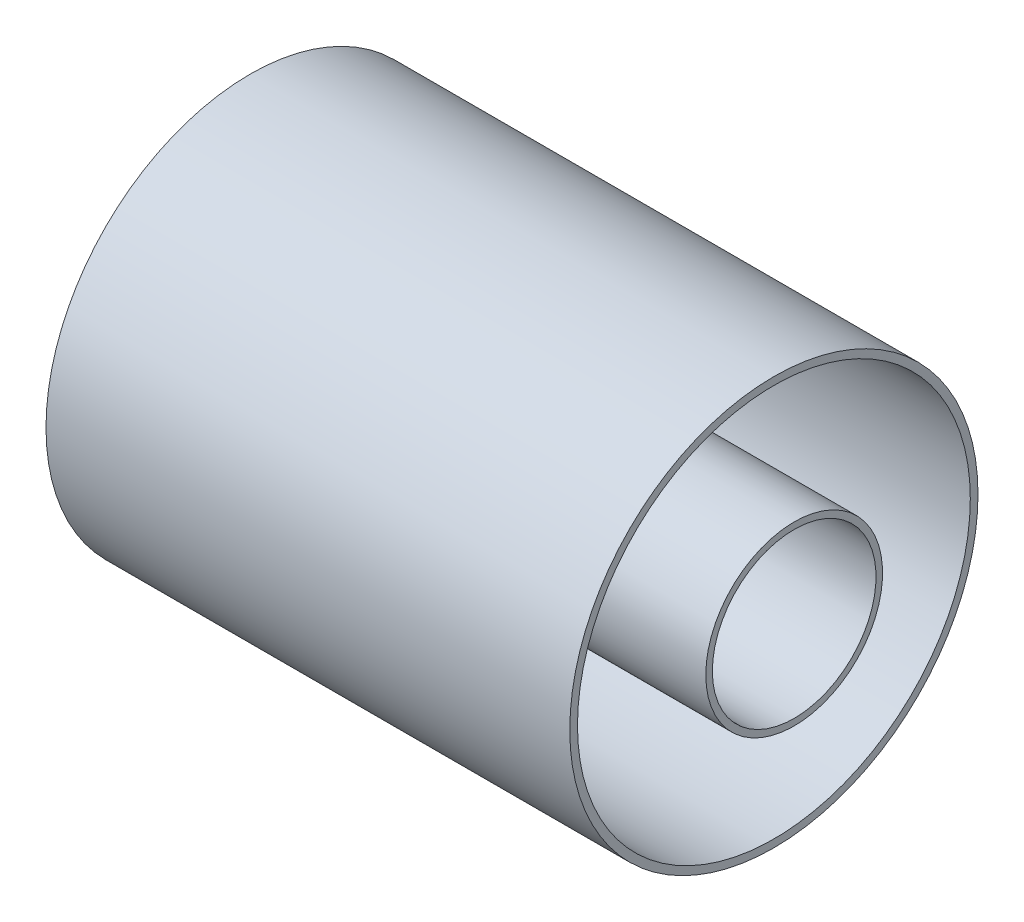
ISO-10303-21;
HEADER;
FILE_DESCRIPTION(('STEP AP214'),'2;1');
FILE_NAME('part.step','',(''),(''),'','','');
FILE_SCHEMA(('AUTOMOTIVE_DESIGN { 1 0 10303 214 1 1 1 1 }'));
ENDSEC;
DATA;
#1=APPLICATION_CONTEXT('core data for automotive mechanical design processes');
#2=APPLICATION_PROTOCOL_DEFINITION('international standard','automotive_design',2000,#1);
#3=PRODUCT_CONTEXT('',#1,'mechanical');
#4=PRODUCT('Part','Part','',(#3));
#5=PRODUCT_RELATED_PRODUCT_CATEGORY('part','',(#4));
#6=PRODUCT_DEFINITION_FORMATION('','',#4);
#7=PRODUCT_DEFINITION_CONTEXT('part definition',#1,'design');
#8=PRODUCT_DEFINITION('design','',#6,#7);
#9=PRODUCT_DEFINITION_SHAPE('','',#8);
#10=(LENGTH_UNIT() NAMED_UNIT(*) SI_UNIT(.MILLI.,.METRE.));
#11=(NAMED_UNIT(*) PLANE_ANGLE_UNIT() SI_UNIT($,.RADIAN.));
#12=(NAMED_UNIT(*) SI_UNIT($,.STERADIAN.) SOLID_ANGLE_UNIT());
#13=UNCERTAINTY_MEASURE_WITH_UNIT(LENGTH_MEASURE(1.E-05),#10,'distance_accuracy_value','');
#14=(GEOMETRIC_REPRESENTATION_CONTEXT(3) GLOBAL_UNCERTAINTY_ASSIGNED_CONTEXT((#13)) GLOBAL_UNIT_ASSIGNED_CONTEXT((#10,
#11,#12)) REPRESENTATION_CONTEXT('',''));
#15=CARTESIAN_POINT('',(0.,0.,0.));
#16=DIRECTION('',(0.,0.,1.));
#17=DIRECTION('',(1.,0.,0.));
#18=AXIS2_PLACEMENT_3D('',#15,#16,#17);
#19=CARTESIAN_POINT('',(-150.920009985663,79.1845,0.));
#20=DIRECTION('',(1.,0.,0.));
#21=DIRECTION('',(0.,0.,-1.));
#22=AXIS2_PLACEMENT_3D('',#19,#20,#21);
#23=PLANE('',#22);
#24=CARTESIAN_POINT('',(-150.920009985663,0.,0.));
#25=DIRECTION('',(-1.,0.,0.));
#26=DIRECTION('',(0.,0.,1.));
#27=AXIS2_PLACEMENT_3D('',#24,#25,#26);
#28=CIRCLE('',#27,76.2);
#29=CARTESIAN_POINT('',(-150.920009985663,0.,76.2));
#30=VERTEX_POINT('',#29);
#31=EDGE_CURVE('E58',#30,#30,#28,.T.);
#32=ORIENTED_EDGE('',*,*,#31,.F.);
#33=EDGE_LOOP('',(#32));
#34=FACE_BOUND('',#33,.T.);
#35=CARTESIAN_POINT('',(-150.920009985663,0.,0.));
#36=DIRECTION('',(-1.,0.,0.));
#37=DIRECTION('',(0.,0.,1.));
#38=AXIS2_PLACEMENT_3D('',#35,#36,#37);
#39=CIRCLE('',#38,79.1845);
#40=CARTESIAN_POINT('',(-150.920009985663,0.,79.1845));
#41=VERTEX_POINT('',#40);
#42=EDGE_CURVE('E11',#41,#41,#39,.T.);
#43=ORIENTED_EDGE('',*,*,#42,.T.);
#44=EDGE_LOOP('',(#43));
#45=FACE_BOUND('',#44,.T.);
#46=ADVANCED_FACE('F43',(#34,#45),#23,.F.);
#47=CARTESIAN_POINT('',(0.,0.,0.));
#48=DIRECTION('',(-1.,0.,0.));
#49=DIRECTION('',(0.,0.,1.));
#50=AXIS2_PLACEMENT_3D('',#47,#48,#49);
#51=CYLINDRICAL_SURFACE('',#50,76.2);
#52=CARTESIAN_POINT('',(52.2799900143375,0.,0.));
#53=DIRECTION('',(-1.,0.,0.));
#54=DIRECTION('',(0.,0.,1.));
#55=AXIS2_PLACEMENT_3D('',#52,#53,#54);
#56=CIRCLE('',#55,76.2);
#57=CARTESIAN_POINT('',(52.2799900143375,0.,76.2));
#58=VERTEX_POINT('',#57);
#59=EDGE_CURVE('E54',#58,#58,#56,.T.);
#60=ORIENTED_EDGE('',*,*,#59,.F.);
#61=EDGE_LOOP('',(#60));
#62=FACE_BOUND('',#61,.T.);
#63=ORIENTED_EDGE('',*,*,#31,.T.);
#64=EDGE_LOOP('',(#63));
#65=FACE_BOUND('',#64,.T.);
#66=ADVANCED_FACE('F64',(#62,#65),#51,.F.);
#67=CARTESIAN_POINT('',(52.2799900143375,79.1845,0.));
#68=DIRECTION('',(1.,0.,0.));
#69=DIRECTION('',(0.,0.,-1.));
#70=AXIS2_PLACEMENT_3D('',#67,#68,#69);
#71=PLANE('',#70);
#72=ORIENTED_EDGE('',*,*,#59,.T.);
#73=EDGE_LOOP('',(#72));
#74=FACE_BOUND('',#73,.T.);
#75=CARTESIAN_POINT('',(52.2799900143375,0.,0.));
#76=DIRECTION('',(-1.,0.,0.));
#77=DIRECTION('',(0.,0.,1.));
#78=AXIS2_PLACEMENT_3D('',#75,#76,#77);
#79=CIRCLE('',#78,79.1845);
#80=CARTESIAN_POINT('',(52.2799900143375,0.,79.1845));
#81=VERTEX_POINT('',#80);
#82=EDGE_CURVE('E50',#81,#81,#79,.T.);
#83=ORIENTED_EDGE('',*,*,#82,.F.);
#84=EDGE_LOOP('',(#83));
#85=FACE_BOUND('',#84,.T.);
#86=ADVANCED_FACE('F71',(#74,#85),#71,.T.);
#87=CARTESIAN_POINT('',(0.,0.,0.));
#88=DIRECTION('',(-1.,0.,0.));
#89=DIRECTION('',(0.,0.,1.));
#90=AXIS2_PLACEMENT_3D('',#87,#88,#89);
#91=CYLINDRICAL_SURFACE('',#90,79.1845);
#92=ORIENTED_EDGE('',*,*,#82,.T.);
#93=EDGE_LOOP('',(#92));
#94=FACE_BOUND('',#93,.T.);
#95=ORIENTED_EDGE('',*,*,#42,.F.);
#96=EDGE_LOOP('',(#95));
#97=FACE_BOUND('',#96,.T.);
#98=ADVANCED_FACE('F45',(#94,#97),#91,.T.);
#99=CLOSED_SHELL('',(#46,#66,#86,#98));
#100=MANIFOLD_SOLID_BREP('B2',#99);
#101=CARTESIAN_POINT('',(-154.984009985663,34.29,0.));
#102=DIRECTION('',(1.,0.,0.));
#103=DIRECTION('',(0.,0.,-1.));
#104=AXIS2_PLACEMENT_3D('',#101,#102,#103);
#105=PLANE('',#104);
#106=CARTESIAN_POINT('',(-154.984009985663,0.,0.));
#107=DIRECTION('',(-1.,0.,0.));
#108=DIRECTION('',(0.,0.,1.));
#109=AXIS2_PLACEMENT_3D('',#106,#107,#108);
#110=CIRCLE('',#109,31.75);
#111=CARTESIAN_POINT('',(-154.984009985663,0.,31.75));
#112=VERTEX_POINT('',#111);
#113=EDGE_CURVE('E42',#112,#112,#110,.T.);
#114=ORIENTED_EDGE('',*,*,#113,.F.);
#115=EDGE_LOOP('',(#114));
#116=FACE_BOUND('',#115,.T.);
#117=CARTESIAN_POINT('',(-154.984009985663,0.,0.));
#118=DIRECTION('',(-1.,0.,0.));
#119=DIRECTION('',(0.,0.,1.));
#120=AXIS2_PLACEMENT_3D('',#117,#118,#119);
#121=CIRCLE('',#120,34.29);
#122=CARTESIAN_POINT('',(-154.984009985663,0.,34.29));
#123=VERTEX_POINT('',#122);
#124=EDGE_CURVE('E127',#123,#123,#121,.T.);
#125=ORIENTED_EDGE('',*,*,#124,.T.);
#126=EDGE_LOOP('',(#125));
#127=FACE_BOUND('',#126,.T.);
#128=ADVANCED_FACE('F113',(#116,#127),#105,.F.);
#129=CARTESIAN_POINT('',(0.,0.,0.));
#130=DIRECTION('',(-1.,0.,0.));
#131=DIRECTION('',(0.,0.,1.));
#132=AXIS2_PLACEMENT_3D('',#129,#130,#131);
#133=CYLINDRICAL_SURFACE('',#132,31.75);
#134=CARTESIAN_POINT('',(60.1539900143375,0.,0.));
#135=DIRECTION('',(-1.,0.,0.));
#136=DIRECTION('',(0.,0.,1.));
#137=AXIS2_PLACEMENT_3D('',#134,#135,#136);
#138=CIRCLE('',#137,31.75);
#139=CARTESIAN_POINT('',(60.1539900143375,0.,31.75));
#140=VERTEX_POINT('',#139);
#141=EDGE_CURVE('E119',#140,#140,#138,.T.);
#142=ORIENTED_EDGE('',*,*,#141,.F.);
#143=EDGE_LOOP('',(#142));
#144=FACE_BOUND('',#143,.T.);
#145=ORIENTED_EDGE('',*,*,#113,.T.);
#146=EDGE_LOOP('',(#145));
#147=FACE_BOUND('',#146,.T.);
#148=ADVANCED_FACE('F142',(#144,#147),#133,.F.);
#149=CARTESIAN_POINT('',(60.1539900143375,34.29,0.));
#150=DIRECTION('',(1.,0.,0.));
#151=DIRECTION('',(0.,0.,-1.));
#152=AXIS2_PLACEMENT_3D('',#149,#150,#151);
#153=PLANE('',#152);
#154=ORIENTED_EDGE('',*,*,#141,.T.);
#155=EDGE_LOOP('',(#154));
#156=FACE_BOUND('',#155,.T.);
#157=CARTESIAN_POINT('',(60.1539900143375,0.,0.));
#158=DIRECTION('',(-1.,0.,0.));
#159=DIRECTION('',(0.,0.,1.));
#160=AXIS2_PLACEMENT_3D('',#157,#158,#159);
#161=CIRCLE('',#160,34.29);
#162=CARTESIAN_POINT('',(60.1539900143375,0.,34.29));
#163=VERTEX_POINT('',#162);
#164=EDGE_CURVE('E123',#163,#163,#161,.T.);
#165=ORIENTED_EDGE('',*,*,#164,.F.);
#166=EDGE_LOOP('',(#165));
#167=FACE_BOUND('',#166,.T.);
#168=ADVANCED_FACE('F136',(#156,#167),#153,.T.);
#169=CARTESIAN_POINT('',(0.,0.,0.));
#170=DIRECTION('',(-1.,0.,0.));
#171=DIRECTION('',(0.,0.,1.));
#172=AXIS2_PLACEMENT_3D('',#169,#170,#171);
#173=CYLINDRICAL_SURFACE('',#172,34.29);
#174=ORIENTED_EDGE('',*,*,#164,.T.);
#175=EDGE_LOOP('',(#174));
#176=FACE_BOUND('',#175,.T.);
#177=ORIENTED_EDGE('',*,*,#124,.F.);
#178=EDGE_LOOP('',(#177));
#179=FACE_BOUND('',#178,.T.);
#180=ADVANCED_FACE('F134',(#176,#179),#173,.T.);
#181=CLOSED_SHELL('',(#128,#148,#168,#180));
#182=MANIFOLD_SOLID_BREP('B6',#181);
#183=ADVANCED_BREP_SHAPE_REPRESENTATION('',(#18,#100,#182),#14);
#184=SHAPE_DEFINITION_REPRESENTATION(#9,#183);
ENDSEC;
END-ISO-10303-21;
